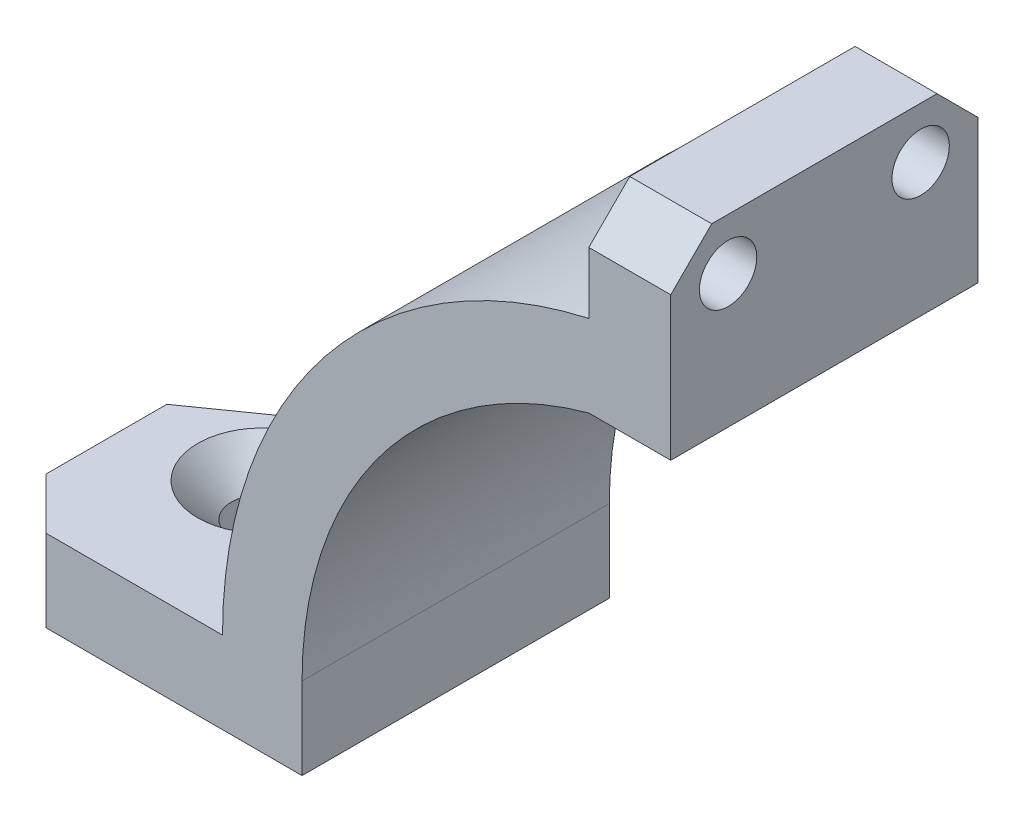
ISO-10303-21;
HEADER;
FILE_DESCRIPTION(('STEP AP214'),'2;1');
FILE_NAME('part.step','',(''),(''),'','','');
FILE_SCHEMA(('AUTOMOTIVE_DESIGN { 1 0 10303 214 1 1 1 1 }'));
ENDSEC;
DATA;
#1=APPLICATION_CONTEXT('core data for automotive mechanical design processes');
#2=APPLICATION_PROTOCOL_DEFINITION('international standard','automotive_design',2000,#1);
#3=PRODUCT_CONTEXT('',#1,'mechanical');
#4=PRODUCT('Part','Part','',(#3));
#5=PRODUCT_RELATED_PRODUCT_CATEGORY('part','',(#4));
#6=PRODUCT_DEFINITION_FORMATION('','',#4);
#7=PRODUCT_DEFINITION_CONTEXT('part definition',#1,'design');
#8=PRODUCT_DEFINITION('design','',#6,#7);
#9=PRODUCT_DEFINITION_SHAPE('','',#8);
#10=(LENGTH_UNIT() NAMED_UNIT(*) SI_UNIT(.MILLI.,.METRE.));
#11=(NAMED_UNIT(*) PLANE_ANGLE_UNIT() SI_UNIT($,.RADIAN.));
#12=(NAMED_UNIT(*) SI_UNIT($,.STERADIAN.) SOLID_ANGLE_UNIT());
#13=UNCERTAINTY_MEASURE_WITH_UNIT(LENGTH_MEASURE(1.E-05),#10,'distance_accuracy_value','');
#14=(GEOMETRIC_REPRESENTATION_CONTEXT(3) GLOBAL_UNCERTAINTY_ASSIGNED_CONTEXT((#13)) GLOBAL_UNIT_ASSIGNED_CONTEXT((#10,
#11,#12)) REPRESENTATION_CONTEXT('',''));
#15=CARTESIAN_POINT('',(0.,0.,0.));
#16=DIRECTION('',(0.,0.,1.));
#17=DIRECTION('',(1.,0.,0.));
#18=AXIS2_PLACEMENT_3D('',#15,#16,#17);
#19=CARTESIAN_POINT('',(0.,0.,15.));
#20=DIRECTION('',(0.,0.,-1.));
#21=DIRECTION('',(-1.,0.,0.));
#22=AXIS2_PLACEMENT_3D('',#19,#20,#21);
#23=CYLINDRICAL_SURFACE('',#22,19.);
#24=CARTESIAN_POINT('',(0.,0.,0.));
#25=DIRECTION('',(0.,0.,-1.));
#26=DIRECTION('',(-1.,0.,0.));
#27=AXIS2_PLACEMENT_3D('',#24,#25,#26);
#28=CIRCLE('',#27,19.);
#29=CARTESIAN_POINT('',(-19.,0.,0.));
#30=VERTEX_POINT('',#29);
#31=CARTESIAN_POINT('',(-5.,18.3303027798234,0.));
#32=VERTEX_POINT('',#31);
#33=EDGE_CURVE('E265',#30,#32,#28,.T.);
#34=ORIENTED_EDGE('',*,*,#33,.T.);
#35=DIRECTION('',(0.,0.,-1.));
#36=VECTOR('',#35,1.);
#37=CARTESIAN_POINT('',(-5.,18.3303027798234,15.));
#38=LINE('',#37,#36);
#39=CARTESIAN_POINT('',(-5.,18.3303027798234,15.));
#40=VERTEX_POINT('',#39);
#41=EDGE_CURVE('E203',#40,#32,#38,.T.);
#42=ORIENTED_EDGE('',*,*,#41,.F.);
#43=CARTESIAN_POINT('',(0.,0.,15.));
#44=DIRECTION('',(0.,0.,-1.));
#45=DIRECTION('',(-1.,0.,0.));
#46=AXIS2_PLACEMENT_3D('',#43,#44,#45);
#47=CIRCLE('',#46,19.);
#48=CARTESIAN_POINT('',(-19.,0.,15.));
#49=VERTEX_POINT('',#48);
#50=EDGE_CURVE('E172',#49,#40,#47,.T.);
#51=ORIENTED_EDGE('',*,*,#50,.F.);
#52=DIRECTION('',(0.,0.,-1.));
#53=VECTOR('',#52,1.);
#54=CARTESIAN_POINT('',(-19.,0.,15.));
#55=LINE('',#54,#53);
#56=EDGE_CURVE('E178',#49,#30,#55,.T.);
#57=ORIENTED_EDGE('',*,*,#56,.T.);
#58=EDGE_LOOP('',(#34,#42,#51,#57));
#59=FACE_BOUND('',#58,.T.);
#60=ADVANCED_FACE('F47',(#59),#23,.F.);
#61=CARTESIAN_POINT('',(-0.999999999999999,18.3303027798234,15.));
#62=DIRECTION('',(0.,1.,0.));
#63=DIRECTION('',(0.,0.,1.));
#64=AXIS2_PLACEMENT_3D('',#61,#62,#63);
#65=PLANE('',#64);
#66=DIRECTION('',(1.,0.,0.));
#67=VECTOR('',#66,1.);
#68=CARTESIAN_POINT('',(-0.999999999999999,18.3303027798234,0.));
#69=LINE('',#68,#67);
#70=CARTESIAN_POINT('',(-0.999999999999999,18.3303027798234,0.));
#71=VERTEX_POINT('',#70);
#72=EDGE_CURVE('E261',#32,#71,#69,.T.);
#73=ORIENTED_EDGE('',*,*,#72,.T.);
#74=DIRECTION('',(0.,0.,-1.));
#75=VECTOR('',#74,1.);
#76=CARTESIAN_POINT('',(-0.999999999999999,18.3303027798234,15.));
#77=LINE('',#76,#75);
#78=CARTESIAN_POINT('',(-0.999999999999999,18.3303027798234,15.));
#79=VERTEX_POINT('',#78);
#80=EDGE_CURVE('E200',#79,#71,#77,.T.);
#81=ORIENTED_EDGE('',*,*,#80,.F.);
#82=DIRECTION('',(1.,0.,0.));
#83=VECTOR('',#82,1.);
#84=CARTESIAN_POINT('',(-0.999999999999999,18.3303027798234,15.));
#85=LINE('',#84,#83);
#86=EDGE_CURVE('E243',#40,#79,#85,.T.);
#87=ORIENTED_EDGE('',*,*,#86,.F.);
#88=ORIENTED_EDGE('',*,*,#41,.T.);
#89=EDGE_LOOP('',(#73,#81,#87,#88));
#90=FACE_BOUND('',#89,.T.);
#91=ADVANCED_FACE('F331',(#90),#65,.F.);
#92=CARTESIAN_POINT('',(-1.,27.3303027798234,15.));
#93=DIRECTION('',(-1.,0.,0.));
#94=DIRECTION('',(0.,-1.,0.));
#95=AXIS2_PLACEMENT_3D('',#92,#93,#94);
#96=PLANE('',#95);
#97=CARTESIAN_POINT('',(-0.999999999999999,24.8303027798234,2.8));
#98=DIRECTION('',(-1.,0.,0.));
#99=DIRECTION('',(0.,-1.,0.));
#100=AXIS2_PLACEMENT_3D('',#97,#98,#99);
#101=CIRCLE('',#100,1.4);
#102=CARTESIAN_POINT('',(-0.999999999999999,23.4303027798234,2.8));
#103=VERTEX_POINT('',#102);
#104=EDGE_CURVE('E268',#103,#103,#101,.T.);
#105=ORIENTED_EDGE('',*,*,#104,.T.);
#106=EDGE_LOOP('',(#105));
#107=FACE_BOUND('',#106,.T.);
#108=CARTESIAN_POINT('',(-0.999999999999999,24.8303027798234,12.2));
#109=DIRECTION('',(-1.,0.,0.));
#110=DIRECTION('',(0.,-1.,0.));
#111=AXIS2_PLACEMENT_3D('',#108,#109,#110);
#112=CIRCLE('',#111,1.4);
#113=CARTESIAN_POINT('',(-0.999999999999999,23.4303027798234,12.2));
#114=VERTEX_POINT('',#113);
#115=EDGE_CURVE('E282',#114,#114,#112,.T.);
#116=ORIENTED_EDGE('',*,*,#115,.T.);
#117=EDGE_LOOP('',(#116));
#118=FACE_BOUND('',#117,.T.);
#119=DIRECTION('',(0.,0.,-1.));
#120=VECTOR('',#119,1.);
#121=CARTESIAN_POINT('',(-1.,27.3303027798234,15.));
#122=LINE('',#121,#120);
#123=CARTESIAN_POINT('',(-1.,27.3303027798234,13.));
#124=VERTEX_POINT('',#123);
#125=CARTESIAN_POINT('',(-1.,27.3303027798234,2.));
#126=VERTEX_POINT('',#125);
#127=EDGE_CURVE('E197',#124,#126,#122,.T.);
#128=ORIENTED_EDGE('',*,*,#127,.F.);
#129=DIRECTION('',(0.,0.707106781186546,-0.707106781186549));
#130=VECTOR('',#129,1.);
#131=CARTESIAN_POINT('',(-1.,25.3303027798234,15.));
#132=LINE('',#131,#130);
#133=CARTESIAN_POINT('',(-1.,25.3303027798234,15.));
#134=VERTEX_POINT('',#133);
#135=EDGE_CURVE('E57',#124,#134,#132,.F.);
#136=ORIENTED_EDGE('',*,*,#135,.T.);
#137=DIRECTION('',(0.,1.,0.));
#138=VECTOR('',#137,1.);
#139=CARTESIAN_POINT('',(-1.,27.3303027798234,15.));
#140=LINE('',#139,#138);
#141=EDGE_CURVE('E235',#79,#134,#140,.T.);
#142=ORIENTED_EDGE('',*,*,#141,.F.);
#143=ORIENTED_EDGE('',*,*,#80,.T.);
#144=DIRECTION('',(0.,1.,0.));
#145=VECTOR('',#144,1.);
#146=CARTESIAN_POINT('',(-1.,27.3303027798234,0.));
#147=LINE('',#146,#145);
#148=CARTESIAN_POINT('',(-1.,25.3303027798234,0.));
#149=VERTEX_POINT('',#148);
#150=EDGE_CURVE('E259',#71,#149,#147,.T.);
#151=ORIENTED_EDGE('',*,*,#150,.T.);
#152=DIRECTION('',(0.,0.707106781186549,0.707106781186546));
#153=VECTOR('',#152,1.);
#154=CARTESIAN_POINT('',(-1.,27.3303027798234,2.));
#155=LINE('',#154,#153);
#156=EDGE_CURVE('E227',#149,#126,#155,.T.);
#157=ORIENTED_EDGE('',*,*,#156,.T.);
#158=EDGE_LOOP('',(#128,#136,#142,#143,#151,#157));
#159=FACE_BOUND('',#158,.T.);
#160=ADVANCED_FACE('F234',(#107,#118,#159),#96,.F.);
#161=CARTESIAN_POINT('',(-5.,27.3303027798234,15.));
#162=DIRECTION('',(0.,-1.,0.));
#163=DIRECTION('',(0.,0.,-1.));
#164=AXIS2_PLACEMENT_3D('',#161,#162,#163);
#165=PLANE('',#164);
#166=DIRECTION('',(0.,0.,-1.));
#167=VECTOR('',#166,1.);
#168=CARTESIAN_POINT('',(-5.,27.3303027798234,15.));
#169=LINE('',#168,#167);
#170=CARTESIAN_POINT('',(-5.,27.3303027798234,13.));
#171=VERTEX_POINT('',#170);
#172=CARTESIAN_POINT('',(-5.,27.3303027798234,2.));
#173=VERTEX_POINT('',#172);
#174=EDGE_CURVE('E194',#171,#173,#169,.T.);
#175=ORIENTED_EDGE('',*,*,#174,.F.);
#176=DIRECTION('',(1.,0.,0.));
#177=VECTOR('',#176,1.);
#178=CARTESIAN_POINT('',(-5.,27.3303027798234,13.));
#179=LINE('',#178,#177);
#180=EDGE_CURVE('E225',#171,#124,#179,.T.);
#181=ORIENTED_EDGE('',*,*,#180,.T.);
#182=ORIENTED_EDGE('',*,*,#127,.T.);
#183=DIRECTION('',(-1.,0.,0.));
#184=VECTOR('',#183,1.);
#185=CARTESIAN_POINT('',(-5.,27.3303027798234,2.));
#186=LINE('',#185,#184);
#187=EDGE_CURVE('E222',#126,#173,#186,.T.);
#188=ORIENTED_EDGE('',*,*,#187,.T.);
#189=EDGE_LOOP('',(#175,#181,#182,#188));
#190=FACE_BOUND('',#189,.T.);
#191=ADVANCED_FACE('F253',(#190),#165,.F.);
#192=CARTESIAN_POINT('',(-5.,22.3303027798234,15.));
#193=DIRECTION('',(1.,0.,0.));
#194=DIRECTION('',(0.,1.,0.));
#195=AXIS2_PLACEMENT_3D('',#192,#193,#194);
#196=PLANE('',#195);
#197=CARTESIAN_POINT('',(-5.,24.8303027798234,2.8));
#198=DIRECTION('',(-1.,0.,0.));
#199=DIRECTION('',(0.,-1.,0.));
#200=AXIS2_PLACEMENT_3D('',#197,#198,#199);
#201=CIRCLE('',#200,1.4);
#202=CARTESIAN_POINT('',(-5.,23.4303027798234,2.8));
#203=VERTEX_POINT('',#202);
#204=EDGE_CURVE('E285',#203,#203,#201,.T.);
#205=ORIENTED_EDGE('',*,*,#204,.F.);
#206=EDGE_LOOP('',(#205));
#207=FACE_BOUND('',#206,.T.);
#208=CARTESIAN_POINT('',(-5.,24.8303027798234,12.2));
#209=DIRECTION('',(-1.,0.,0.));
#210=DIRECTION('',(0.,-1.,0.));
#211=AXIS2_PLACEMENT_3D('',#208,#209,#210);
#212=CIRCLE('',#211,1.4);
#213=CARTESIAN_POINT('',(-5.,23.4303027798234,12.2));
#214=VERTEX_POINT('',#213);
#215=EDGE_CURVE('E286',#214,#214,#212,.T.);
#216=ORIENTED_EDGE('',*,*,#215,.F.);
#217=EDGE_LOOP('',(#216));
#218=FACE_BOUND('',#217,.T.);
#219=DIRECTION('',(0.,-1.,0.));
#220=VECTOR('',#219,1.);
#221=CARTESIAN_POINT('',(-5.,22.3303027798234,15.));
#222=LINE('',#221,#220);
#223=CARTESIAN_POINT('',(-5.,25.3303027798234,15.));
#224=VERTEX_POINT('',#223);
#225=CARTESIAN_POINT('',(-5.,22.3303027798234,15.));
#226=VERTEX_POINT('',#225);
#227=EDGE_CURVE('E245',#224,#226,#222,.T.);
#228=ORIENTED_EDGE('',*,*,#227,.F.);
#229=DIRECTION('',(0.,-0.707106781186546,0.707106781186549));
#230=VECTOR('',#229,1.);
#231=CARTESIAN_POINT('',(-5.,25.3303027798234,15.));
#232=LINE('',#231,#230);
#233=EDGE_CURVE('E220',#224,#171,#232,.F.);
#234=ORIENTED_EDGE('',*,*,#233,.T.);
#235=ORIENTED_EDGE('',*,*,#174,.T.);
#236=DIRECTION('',(0.,-0.707106781186549,-0.707106781186546));
#237=VECTOR('',#236,1.);
#238=CARTESIAN_POINT('',(-5.,27.3303027798234,2.));
#239=LINE('',#238,#237);
#240=CARTESIAN_POINT('',(-5.,25.3303027798234,0.));
#241=VERTEX_POINT('',#240);
#242=EDGE_CURVE('E218',#173,#241,#239,.T.);
#243=ORIENTED_EDGE('',*,*,#242,.T.);
#244=DIRECTION('',(0.,-1.,0.));
#245=VECTOR('',#244,1.);
#246=CARTESIAN_POINT('',(-5.,22.3303027798234,0.));
#247=LINE('',#246,#245);
#248=CARTESIAN_POINT('',(-5.,22.3303027798234,0.));
#249=VERTEX_POINT('',#248);
#250=EDGE_CURVE('E257',#241,#249,#247,.T.);
#251=ORIENTED_EDGE('',*,*,#250,.T.);
#252=DIRECTION('',(0.,0.,-1.));
#253=VECTOR('',#252,1.);
#254=CARTESIAN_POINT('',(-5.,22.3303027798234,15.));
#255=LINE('',#254,#253);
#256=EDGE_CURVE('E191',#226,#249,#255,.T.);
#257=ORIENTED_EDGE('',*,*,#256,.F.);
#258=EDGE_LOOP('',(#228,#234,#235,#243,#251,#257));
#259=FACE_BOUND('',#258,.T.);
#260=ADVANCED_FACE('F250',(#207,#218,#259),#196,.F.);
#261=CARTESIAN_POINT('',(0.,0.,15.));
#262=DIRECTION('',(0.,0.,-1.));
#263=DIRECTION('',(-1.,0.,0.));
#264=AXIS2_PLACEMENT_3D('',#261,#262,#263);
#265=CYLINDRICAL_SURFACE('',#264,22.8832345230867);
#266=CARTESIAN_POINT('',(0.,0.,0.));
#267=DIRECTION('',(0.,0.,1.));
#268=DIRECTION('',(-1.,0.,0.));
#269=AXIS2_PLACEMENT_3D('',#266,#267,#268);
#270=CIRCLE('',#269,22.8832345230867);
#271=CARTESIAN_POINT('',(-22.8832345230867,0.,0.));
#272=VERTEX_POINT('',#271);
#273=EDGE_CURVE('E174',#249,#272,#270,.T.);
#274=ORIENTED_EDGE('',*,*,#273,.T.);
#275=DIRECTION('',(0.,0.,-1.));
#276=VECTOR('',#275,1.);
#277=CARTESIAN_POINT('',(-22.8832345230867,0.,15.));
#278=LINE('',#277,#276);
#279=CARTESIAN_POINT('',(-22.8832345230867,0.,15.));
#280=VERTEX_POINT('',#279);
#281=EDGE_CURVE('E188',#280,#272,#278,.T.);
#282=ORIENTED_EDGE('',*,*,#281,.F.);
#283=CARTESIAN_POINT('',(0.,0.,15.));
#284=DIRECTION('',(0.,0.,1.));
#285=DIRECTION('',(-1.,0.,0.));
#286=AXIS2_PLACEMENT_3D('',#283,#284,#285);
#287=CIRCLE('',#286,22.8832345230867);
#288=EDGE_CURVE('E275',#226,#280,#287,.T.);
#289=ORIENTED_EDGE('',*,*,#288,.F.);
#290=ORIENTED_EDGE('',*,*,#256,.T.);
#291=EDGE_LOOP('',(#274,#282,#289,#290));
#292=FACE_BOUND('',#291,.T.);
#293=ADVANCED_FACE('F306',(#292),#265,.T.);
#294=CARTESIAN_POINT('',(-34.,0.,15.));
#295=DIRECTION('',(0.,-1.,0.));
#296=DIRECTION('',(0.,0.,-1.));
#297=AXIS2_PLACEMENT_3D('',#294,#295,#296);
#298=PLANE('',#297);
#299=CARTESIAN_POINT('',(-28.4416172615434,0.,7.5));
#300=DIRECTION('',(0.,1.,0.));
#301=DIRECTION('',(0.,0.,1.));
#302=AXIS2_PLACEMENT_3D('',#299,#300,#301);
#303=CIRCLE('',#302,3.15);
#304=CARTESIAN_POINT('',(-28.4416172615434,0.,10.65));
#305=VERTEX_POINT('',#304);
#306=EDGE_CURVE('E296',#305,#305,#303,.T.);
#307=ORIENTED_EDGE('',*,*,#306,.F.);
#308=EDGE_LOOP('',(#307));
#309=FACE_BOUND('',#308,.T.);
#310=DIRECTION('',(-1.,0.,0.));
#311=VECTOR('',#310,1.);
#312=CARTESIAN_POINT('',(-34.,0.,0.));
#313=LINE('',#312,#311);
#314=CARTESIAN_POINT('',(-24.6360697013909,0.,0.));
#315=VERTEX_POINT('',#314);
#316=EDGE_CURVE('E170',#272,#315,#313,.T.);
#317=ORIENTED_EDGE('',*,*,#316,.T.);
#318=DIRECTION('',(-0.817355943758289,0.,0.576133023878164));
#319=VECTOR('',#318,1.);
#320=CARTESIAN_POINT('',(-37.9554238059601,0.,9.38846755195163));
#321=LINE('',#320,#319);
#322=CARTESIAN_POINT('',(-34.,0.,6.60039181157212));
#323=VERTEX_POINT('',#322);
#324=EDGE_CURVE('E64',#315,#323,#321,.T.);
#325=ORIENTED_EDGE('',*,*,#324,.T.);
#326=DIRECTION('',(0.,0.,-1.));
#327=VECTOR('',#326,1.);
#328=CARTESIAN_POINT('',(-34.,0.,15.));
#329=LINE('',#328,#327);
#330=CARTESIAN_POINT('',(-34.,0.,12.5));
#331=VERTEX_POINT('',#330);
#332=EDGE_CURVE('E185',#331,#323,#329,.T.);
#333=ORIENTED_EDGE('',*,*,#332,.F.);
#334=DIRECTION('',(-0.707106781186549,0.,-0.707106781186547));
#335=VECTOR('',#334,1.);
#336=CARTESIAN_POINT('',(-31.5,0.,15.));
#337=LINE('',#336,#335);
#338=CARTESIAN_POINT('',(-31.5,0.,15.));
#339=VERTEX_POINT('',#338);
#340=EDGE_CURVE('E210',#331,#339,#337,.F.);
#341=ORIENTED_EDGE('',*,*,#340,.T.);
#342=DIRECTION('',(-1.,0.,0.));
#343=VECTOR('',#342,1.);
#344=CARTESIAN_POINT('',(-34.,0.,15.));
#345=LINE('',#344,#343);
#346=EDGE_CURVE('E272',#280,#339,#345,.T.);
#347=ORIENTED_EDGE('',*,*,#346,.F.);
#348=ORIENTED_EDGE('',*,*,#281,.T.);
#349=EDGE_LOOP('',(#317,#325,#333,#341,#347,#348));
#350=FACE_BOUND('',#349,.T.);
#351=ADVANCED_FACE('F302',(#309,#350),#298,.F.);
#352=CARTESIAN_POINT('',(-34.,-4.,15.));
#353=DIRECTION('',(1.,0.,0.));
#354=DIRECTION('',(0.,1.,0.));
#355=AXIS2_PLACEMENT_3D('',#352,#353,#354);
#356=PLANE('',#355);
#357=ORIENTED_EDGE('',*,*,#332,.T.);
#358=DIRECTION('',(0.,-1.,0.));
#359=VECTOR('',#358,1.);
#360=CARTESIAN_POINT('',(-34.,21.,6.60039181157212));
#361=LINE('',#360,#359);
#362=CARTESIAN_POINT('',(-34.,-4.,6.60039181157212));
#363=VERTEX_POINT('',#362);
#364=EDGE_CURVE('E155',#323,#363,#361,.T.);
#365=ORIENTED_EDGE('',*,*,#364,.T.);
#366=DIRECTION('',(0.,0.,-1.));
#367=VECTOR('',#366,1.);
#368=CARTESIAN_POINT('',(-34.,-4.,15.));
#369=LINE('',#368,#367);
#370=CARTESIAN_POINT('',(-34.,-4.,12.5));
#371=VERTEX_POINT('',#370);
#372=EDGE_CURVE('E164',#371,#363,#369,.T.);
#373=ORIENTED_EDGE('',*,*,#372,.F.);
#374=DIRECTION('',(0.,1.,0.));
#375=VECTOR('',#374,1.);
#376=CARTESIAN_POINT('',(-34.,-4.,12.5));
#377=LINE('',#376,#375);
#378=EDGE_CURVE('E206',#371,#331,#377,.T.);
#379=ORIENTED_EDGE('',*,*,#378,.T.);
#380=EDGE_LOOP('',(#357,#365,#373,#379));
#381=FACE_BOUND('',#380,.T.);
#382=ADVANCED_FACE('F305',(#381),#356,.F.);
#383=CARTESIAN_POINT('',(-19.,-4.,15.));
#384=DIRECTION('',(0.,1.,0.));
#385=DIRECTION('',(-1.,0.,0.));
#386=AXIS2_PLACEMENT_3D('',#383,#384,#385);
#387=PLANE('',#386);
#388=CARTESIAN_POINT('',(-28.4416172615434,-4.,7.5));
#389=DIRECTION('',(0.,1.,0.));
#390=DIRECTION('',(-1.,0.,0.));
#391=AXIS2_PLACEMENT_3D('',#388,#389,#390);
#392=CIRCLE('',#391,1.49999999999999);
#393=CARTESIAN_POINT('',(-29.9416172615433,-4.,7.5));
#394=VERTEX_POINT('',#393);
#395=EDGE_CURVE('E52',#394,#394,#392,.T.);
#396=ORIENTED_EDGE('',*,*,#395,.T.);
#397=EDGE_LOOP('',(#396));
#398=FACE_BOUND('',#397,.T.);
#399=ORIENTED_EDGE('',*,*,#372,.T.);
#400=DIRECTION('',(-0.817355943758289,0.,0.576133023878164));
#401=VECTOR('',#400,1.);
#402=CARTESIAN_POINT('',(-24.6360697013909,-4.,0.));
#403=LINE('',#402,#401);
#404=CARTESIAN_POINT('',(-24.6360697013909,-4.,0.));
#405=VERTEX_POINT('',#404);
#406=EDGE_CURVE('E150',#405,#363,#403,.T.);
#407=ORIENTED_EDGE('',*,*,#406,.F.);
#408=DIRECTION('',(1.,0.,0.));
#409=VECTOR('',#408,1.);
#410=CARTESIAN_POINT('',(-19.,-4.,0.));
#411=LINE('',#410,#409);
#412=CARTESIAN_POINT('',(-19.,-4.,0.));
#413=VERTEX_POINT('',#412);
#414=EDGE_CURVE('E161',#405,#413,#411,.T.);
#415=ORIENTED_EDGE('',*,*,#414,.T.);
#416=DIRECTION('',(0.,0.,-1.));
#417=VECTOR('',#416,1.);
#418=CARTESIAN_POINT('',(-19.,-4.,15.));
#419=LINE('',#418,#417);
#420=CARTESIAN_POINT('',(-19.,-4.,15.));
#421=VERTEX_POINT('',#420);
#422=EDGE_CURVE('E181',#421,#413,#419,.T.);
#423=ORIENTED_EDGE('',*,*,#422,.F.);
#424=DIRECTION('',(1.,0.,0.));
#425=VECTOR('',#424,1.);
#426=CARTESIAN_POINT('',(-19.,-4.,15.));
#427=LINE('',#426,#425);
#428=CARTESIAN_POINT('',(-31.5,-4.,15.));
#429=VERTEX_POINT('',#428);
#430=EDGE_CURVE('E270',#429,#421,#427,.T.);
#431=ORIENTED_EDGE('',*,*,#430,.F.);
#432=DIRECTION('',(0.707106781186549,0.,0.707106781186547));
#433=VECTOR('',#432,1.);
#434=CARTESIAN_POINT('',(-31.5,-4.,15.));
#435=LINE('',#434,#433);
#436=EDGE_CURVE('E208',#429,#371,#435,.F.);
#437=ORIENTED_EDGE('',*,*,#436,.T.);
#438=EDGE_LOOP('',(#399,#407,#415,#423,#431,#437));
#439=FACE_BOUND('',#438,.T.);
#440=ADVANCED_FACE('F159',(#398,#439),#387,.F.);
#441=CARTESIAN_POINT('',(-19.,0.,15.));
#442=DIRECTION('',(-1.,0.,0.));
#443=DIRECTION('',(0.,-1.,0.));
#444=AXIS2_PLACEMENT_3D('',#441,#442,#443);
#445=PLANE('',#444);
#446=DIRECTION('',(0.,1.,0.));
#447=VECTOR('',#446,1.);
#448=CARTESIAN_POINT('',(-19.,0.,0.));
#449=LINE('',#448,#447);
#450=EDGE_CURVE('E169',#413,#30,#449,.T.);
#451=ORIENTED_EDGE('',*,*,#450,.T.);
#452=ORIENTED_EDGE('',*,*,#56,.F.);
#453=DIRECTION('',(0.,1.,0.));
#454=VECTOR('',#453,1.);
#455=CARTESIAN_POINT('',(-19.,0.,15.));
#456=LINE('',#455,#454);
#457=EDGE_CURVE('E182',#421,#49,#456,.T.);
#458=ORIENTED_EDGE('',*,*,#457,.F.);
#459=ORIENTED_EDGE('',*,*,#422,.T.);
#460=EDGE_LOOP('',(#451,#452,#458,#459));
#461=FACE_BOUND('',#460,.T.);
#462=ADVANCED_FACE('F327',(#461),#445,.F.);
#463=CARTESIAN_POINT('',(0.,0.,15.));
#464=DIRECTION('',(0.,0.,-1.));
#465=DIRECTION('',(-1.,0.,0.));
#466=AXIS2_PLACEMENT_3D('',#463,#464,#465);
#467=PLANE('',#466);
#468=ORIENTED_EDGE('',*,*,#141,.T.);
#469=DIRECTION('',(-1.,0.,0.));
#470=VECTOR('',#469,1.);
#471=CARTESIAN_POINT('',(0.,25.3303027798234,15.));
#472=LINE('',#471,#470);
#473=EDGE_CURVE('E215',#134,#224,#472,.T.);
#474=ORIENTED_EDGE('',*,*,#473,.T.);
#475=ORIENTED_EDGE('',*,*,#227,.T.);
#476=ORIENTED_EDGE('',*,*,#288,.T.);
#477=ORIENTED_EDGE('',*,*,#346,.T.);
#478=DIRECTION('',(0.,-1.,0.));
#479=VECTOR('',#478,1.);
#480=CARTESIAN_POINT('',(-31.5,0.,15.));
#481=LINE('',#480,#479);
#482=EDGE_CURVE('E212',#339,#429,#481,.T.);
#483=ORIENTED_EDGE('',*,*,#482,.T.);
#484=ORIENTED_EDGE('',*,*,#430,.T.);
#485=ORIENTED_EDGE('',*,*,#457,.T.);
#486=ORIENTED_EDGE('',*,*,#50,.T.);
#487=ORIENTED_EDGE('',*,*,#86,.T.);
#488=EDGE_LOOP('',(#468,#474,#475,#476,#477,#483,#484,#485,#486,#487));
#489=FACE_BOUND('',#488,.T.);
#490=ADVANCED_FACE('F240',(#489),#467,.F.);
#491=CARTESIAN_POINT('',(0.,0.,0.));
#492=DIRECTION('',(0.,0.,-1.));
#493=DIRECTION('',(-1.,0.,0.));
#494=AXIS2_PLACEMENT_3D('',#491,#492,#493);
#495=PLANE('',#494);
#496=DIRECTION('',(0.,-1.,0.));
#497=VECTOR('',#496,1.);
#498=CARTESIAN_POINT('',(-24.6360697013909,21.,0.));
#499=LINE('',#498,#497);
#500=EDGE_CURVE('E147',#315,#405,#499,.T.);
#501=ORIENTED_EDGE('',*,*,#500,.F.);
#502=ORIENTED_EDGE('',*,*,#316,.F.);
#503=ORIENTED_EDGE('',*,*,#273,.F.);
#504=ORIENTED_EDGE('',*,*,#250,.F.);
#505=DIRECTION('',(1.,0.,0.));
#506=VECTOR('',#505,1.);
#507=CARTESIAN_POINT('',(-1.,25.3303027798234,0.));
#508=LINE('',#507,#506);
#509=EDGE_CURVE('E11',#241,#149,#508,.T.);
#510=ORIENTED_EDGE('',*,*,#509,.T.);
#511=ORIENTED_EDGE('',*,*,#150,.F.);
#512=ORIENTED_EDGE('',*,*,#72,.F.);
#513=ORIENTED_EDGE('',*,*,#33,.F.);
#514=ORIENTED_EDGE('',*,*,#450,.F.);
#515=ORIENTED_EDGE('',*,*,#414,.F.);
#516=EDGE_LOOP('',(#501,#502,#503,#504,#510,#511,#512,#513,#514,#515));
#517=FACE_BOUND('',#516,.T.);
#518=ADVANCED_FACE('F167',(#517),#495,.T.);
#519=CARTESIAN_POINT('',(-31.5,0.,15.));
#520=DIRECTION('',(0.707106781186547,0.,-0.707106781186549));
#521=DIRECTION('',(0.,-1.,0.));
#522=AXIS2_PLACEMENT_3D('',#519,#520,#521);
#523=PLANE('',#522);
#524=ORIENTED_EDGE('',*,*,#340,.F.);
#525=ORIENTED_EDGE('',*,*,#378,.F.);
#526=ORIENTED_EDGE('',*,*,#436,.F.);
#527=ORIENTED_EDGE('',*,*,#482,.F.);
#528=EDGE_LOOP('',(#524,#525,#526,#527));
#529=FACE_BOUND('',#528,.T.);
#530=ADVANCED_FACE('F317',(#529),#523,.F.);
#531=CARTESIAN_POINT('',(10.,24.8303027798234,12.2));
#532=DIRECTION('',(-1.,0.,0.));
#533=DIRECTION('',(0.,-1.,0.));
#534=AXIS2_PLACEMENT_3D('',#531,#532,#533);
#535=CYLINDRICAL_SURFACE('',#534,1.4);
#536=ORIENTED_EDGE('',*,*,#215,.T.);
#537=EDGE_LOOP('',(#536));
#538=FACE_BOUND('',#537,.T.);
#539=ORIENTED_EDGE('',*,*,#115,.F.);
#540=EDGE_LOOP('',(#539));
#541=FACE_BOUND('',#540,.T.);
#542=ADVANCED_FACE('F346',(#538,#541),#535,.F.);
#543=CARTESIAN_POINT('',(10.,24.8303027798234,2.8));
#544=DIRECTION('',(-1.,0.,0.));
#545=DIRECTION('',(0.,-1.,0.));
#546=AXIS2_PLACEMENT_3D('',#543,#544,#545);
#547=CYLINDRICAL_SURFACE('',#546,1.4);
#548=ORIENTED_EDGE('',*,*,#204,.T.);
#549=EDGE_LOOP('',(#548));
#550=FACE_BOUND('',#549,.T.);
#551=ORIENTED_EDGE('',*,*,#104,.F.);
#552=EDGE_LOOP('',(#551));
#553=FACE_BOUND('',#552,.T.);
#554=ADVANCED_FACE('F350',(#550,#553),#547,.F.);
#555=CARTESIAN_POINT('',(0.,25.3303027798234,15.));
#556=DIRECTION('',(0.,-0.707106781186549,-0.707106781186546));
#557=DIRECTION('',(-1.,0.,0.));
#558=AXIS2_PLACEMENT_3D('',#555,#556,#557);
#559=PLANE('',#558);
#560=ORIENTED_EDGE('',*,*,#135,.F.);
#561=ORIENTED_EDGE('',*,*,#180,.F.);
#562=ORIENTED_EDGE('',*,*,#233,.F.);
#563=ORIENTED_EDGE('',*,*,#473,.F.);
#564=EDGE_LOOP('',(#560,#561,#562,#563));
#565=FACE_BOUND('',#564,.T.);
#566=ADVANCED_FACE('F247',(#565),#559,.F.);
#567=CARTESIAN_POINT('',(-5.,27.3303027798234,2.));
#568=DIRECTION('',(0.,0.707106781186546,-0.707106781186549));
#569=DIRECTION('',(1.,0.,0.));
#570=AXIS2_PLACEMENT_3D('',#567,#568,#569);
#571=PLANE('',#570);
#572=ORIENTED_EDGE('',*,*,#156,.F.);
#573=ORIENTED_EDGE('',*,*,#509,.F.);
#574=ORIENTED_EDGE('',*,*,#242,.F.);
#575=ORIENTED_EDGE('',*,*,#187,.F.);
#576=EDGE_LOOP('',(#572,#573,#574,#575));
#577=FACE_BOUND('',#576,.T.);
#578=ADVANCED_FACE('F50',(#577),#571,.T.);
#579=CARTESIAN_POINT('',(-24.6360697013909,21.,0.));
#580=DIRECTION('',(0.576133023878164,0.,0.817355943758289));
#581=DIRECTION('',(0.817355943758289,0.,-0.576133023878164));
#582=AXIS2_PLACEMENT_3D('',#579,#580,#581);
#583=PLANE('',#582);
#584=ORIENTED_EDGE('',*,*,#500,.T.);
#585=ORIENTED_EDGE('',*,*,#406,.T.);
#586=ORIENTED_EDGE('',*,*,#364,.F.);
#587=ORIENTED_EDGE('',*,*,#324,.F.);
#588=EDGE_LOOP('',(#584,#585,#586,#587));
#589=FACE_BOUND('',#588,.T.);
#590=ADVANCED_FACE('F149',(#589),#583,.F.);
#591=CARTESIAN_POINT('',(-28.4416172615434,0.,7.5));
#592=DIRECTION('',(0.,1.,0.));
#593=DIRECTION('',(0.,0.,1.));
#594=AXIS2_PLACEMENT_3D('',#591,#592,#593);
#595=CYLINDRICAL_SURFACE('',#594,1.49999999999999);
#596=CARTESIAN_POINT('',(-28.4416172615434,-1.65,7.5));
#597=DIRECTION('',(0.,1.,0.));
#598=DIRECTION('',(0.,0.,1.));
#599=AXIS2_PLACEMENT_3D('',#596,#597,#598);
#600=CIRCLE('',#599,1.49999999999999);
#601=CARTESIAN_POINT('',(-28.4416172615434,-1.65,8.99999999999999));
#602=VERTEX_POINT('',#601);
#603=EDGE_CURVE('E293',#602,#602,#600,.T.);
#604=ORIENTED_EDGE('',*,*,#603,.T.);
#605=EDGE_LOOP('',(#604));
#606=FACE_BOUND('',#605,.T.);
#607=ORIENTED_EDGE('',*,*,#395,.F.);
#608=EDGE_LOOP('',(#607));
#609=FACE_BOUND('',#608,.T.);
#610=ADVANCED_FACE('F418',(#606,#609),#595,.F.);
#611=CARTESIAN_POINT('',(-28.4416172615434,0.,7.5));
#612=DIRECTION('',(0.,1.,0.));
#613=DIRECTION('',(0.,0.,1.));
#614=AXIS2_PLACEMENT_3D('',#611,#612,#613);
#615=CONICAL_SURFACE('',#614,3.15,0.78539816339745);
#616=ORIENTED_EDGE('',*,*,#603,.F.);
#617=EDGE_LOOP('',(#616));
#618=FACE_BOUND('',#617,.T.);
#619=ORIENTED_EDGE('',*,*,#306,.T.);
#620=EDGE_LOOP('',(#619));
#621=FACE_BOUND('',#620,.T.);
#622=ADVANCED_FACE('F300',(#618,#621),#615,.F.);
#623=CLOSED_SHELL('',(#60,#91,#160,#191,#260,#293,#351,#382,#440,#462,#490,#518,#530,#542,#554,
#566,#578,#590,#610,#622));
#624=MANIFOLD_SOLID_BREP('B2',#623);
#625=ADVANCED_BREP_SHAPE_REPRESENTATION('',(#18,#624),#14);
#626=SHAPE_DEFINITION_REPRESENTATION(#9,#625);
ENDSEC;
END-ISO-10303-21;
